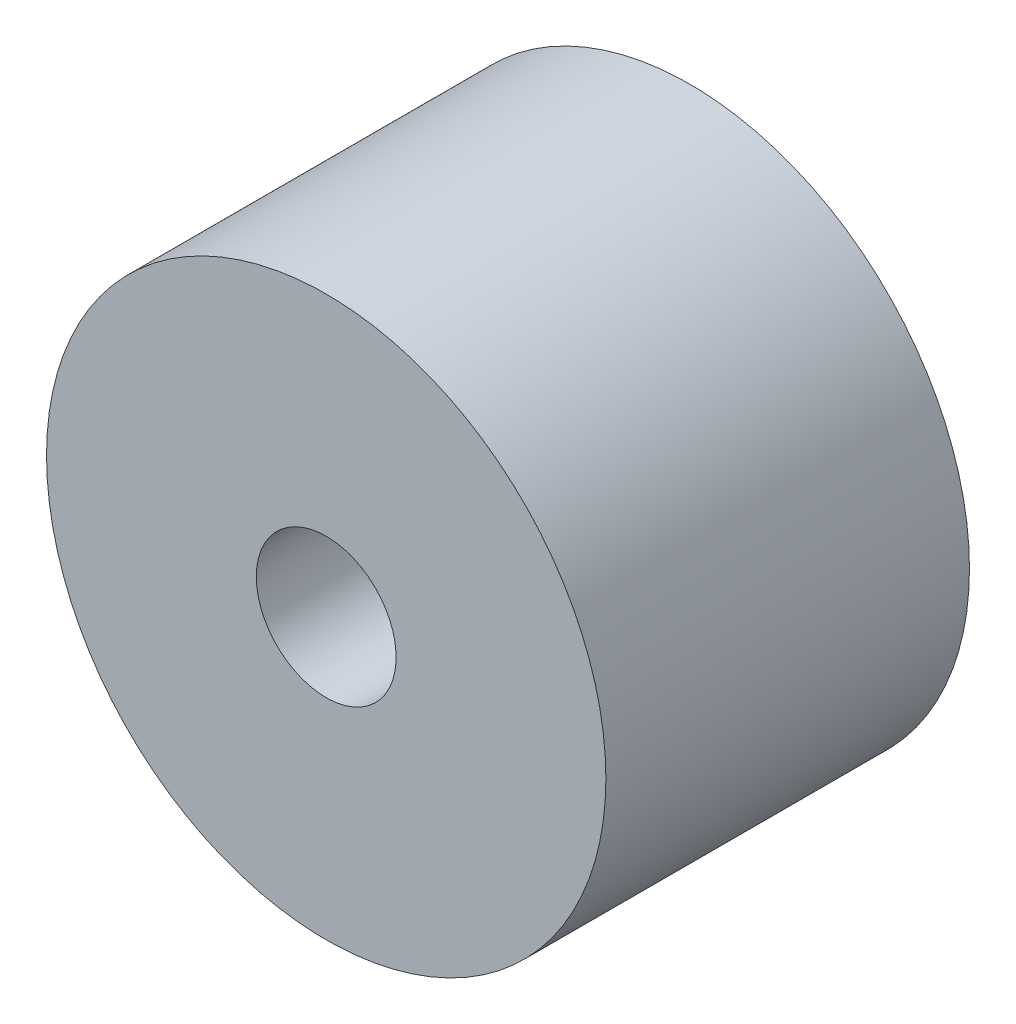
ISO-10303-21;
HEADER;
FILE_DESCRIPTION(('STEP AP214'),'2;1');
FILE_NAME('part.step','',(''),(''),'','','');
FILE_SCHEMA(('AUTOMOTIVE_DESIGN { 1 0 10303 214 1 1 1 1 }'));
ENDSEC;
DATA;
#1=APPLICATION_CONTEXT('core data for automotive mechanical design processes');
#2=APPLICATION_PROTOCOL_DEFINITION('international standard','automotive_design',2000,#1);
#3=PRODUCT_CONTEXT('',#1,'mechanical');
#4=PRODUCT('Part','Part','',(#3));
#5=PRODUCT_RELATED_PRODUCT_CATEGORY('part','',(#4));
#6=PRODUCT_DEFINITION_FORMATION('','',#4);
#7=PRODUCT_DEFINITION_CONTEXT('part definition',#1,'design');
#8=PRODUCT_DEFINITION('design','',#6,#7);
#9=PRODUCT_DEFINITION_SHAPE('','',#8);
#10=(LENGTH_UNIT() NAMED_UNIT(*) SI_UNIT(.MILLI.,.METRE.));
#11=(NAMED_UNIT(*) PLANE_ANGLE_UNIT() SI_UNIT($,.RADIAN.));
#12=(NAMED_UNIT(*) SI_UNIT($,.STERADIAN.) SOLID_ANGLE_UNIT());
#13=UNCERTAINTY_MEASURE_WITH_UNIT(LENGTH_MEASURE(1.E-05),#10,'distance_accuracy_value','');
#14=(GEOMETRIC_REPRESENTATION_CONTEXT(3) GLOBAL_UNCERTAINTY_ASSIGNED_CONTEXT((#13)) GLOBAL_UNIT_ASSIGNED_CONTEXT((#10,
#11,#12)) REPRESENTATION_CONTEXT('',''));
#15=CARTESIAN_POINT('',(0.,0.,0.));
#16=DIRECTION('',(0.,0.,1.));
#17=DIRECTION('',(1.,0.,0.));
#18=AXIS2_PLACEMENT_3D('',#15,#16,#17);
#19=CARTESIAN_POINT('',(0.,0.,13.));
#20=DIRECTION('',(0.,0.,-1.));
#21=DIRECTION('',(-1.,0.,0.));
#22=AXIS2_PLACEMENT_3D('',#19,#20,#21);
#23=CYLINDRICAL_SURFACE('',#22,10.);
#24=CARTESIAN_POINT('',(0.,0.,13.));
#25=DIRECTION('',(0.,0.,1.));
#26=DIRECTION('',(1.,0.,0.));
#27=AXIS2_PLACEMENT_3D('',#24,#25,#26);
#28=CIRCLE('',#27,10.);
#29=CARTESIAN_POINT('',(-10.,0.,13.));
#30=VERTEX_POINT('',#29);
#31=EDGE_CURVE('E47',#30,#30,#28,.T.);
#32=CARTESIAN_POINT('',(0.,0.,0.));
#33=DIRECTION('',(0.,0.,1.));
#34=DIRECTION('',(1.,0.,0.));
#35=AXIS2_PLACEMENT_3D('',#32,#33,#34);
#36=CIRCLE('',#35,10.);
#37=CARTESIAN_POINT('',(-10.,0.,0.));
#38=VERTEX_POINT('',#37);
#39=EDGE_CURVE('E54',#38,#38,#36,.T.);
#40=CARTESIAN_POINT('',(-10.,0.,13.));
#41=CARTESIAN_POINT('',(-10.,0.,12.8645833333333));
#42=CARTESIAN_POINT('',(-10.,0.,12.7291666666667));
#43=CARTESIAN_POINT('',(-10.,0.,12.4583333333333));
#44=CARTESIAN_POINT('',(-10.,0.,12.3229166666667));
#45=CARTESIAN_POINT('',(-10.,0.,12.0520833333333));
#46=CARTESIAN_POINT('',(-10.,0.,11.9166666666667));
#47=CARTESIAN_POINT('',(-10.,0.,11.6458333333333));
#48=CARTESIAN_POINT('',(-10.,0.,11.5104166666667));
#49=CARTESIAN_POINT('',(-10.,0.,11.2395833333333));
#50=CARTESIAN_POINT('',(-10.,0.,11.1041666666667));
#51=CARTESIAN_POINT('',(-10.,0.,10.8333333333333));
#52=CARTESIAN_POINT('',(-10.,0.,10.6979166666667));
#53=CARTESIAN_POINT('',(-10.,0.,10.4270833333333));
#54=CARTESIAN_POINT('',(-10.,0.,10.2916666666667));
#55=CARTESIAN_POINT('',(-10.,0.,10.0208333333333));
#56=CARTESIAN_POINT('',(-10.,0.,9.88541666666667));
#57=CARTESIAN_POINT('',(-10.,0.,9.61458333333333));
#58=CARTESIAN_POINT('',(-10.,0.,9.47916666666667));
#59=CARTESIAN_POINT('',(-10.,0.,9.20833333333333));
#60=CARTESIAN_POINT('',(-10.,0.,9.07291666666666));
#61=CARTESIAN_POINT('',(-10.,0.,8.80208333333333));
#62=CARTESIAN_POINT('',(-10.,0.,8.66666666666667));
#63=CARTESIAN_POINT('',(-10.,0.,8.39583333333333));
#64=CARTESIAN_POINT('',(-10.,0.,8.26041666666667));
#65=CARTESIAN_POINT('',(-10.,0.,7.98958333333333));
#66=CARTESIAN_POINT('',(-10.,0.,7.85416666666667));
#67=CARTESIAN_POINT('',(-10.,0.,7.58333333333333));
#68=CARTESIAN_POINT('',(-10.,0.,7.44791666666667));
#69=CARTESIAN_POINT('',(-10.,0.,7.17708333333333));
#70=CARTESIAN_POINT('',(-10.,0.,7.04166666666667));
#71=CARTESIAN_POINT('',(-10.,0.,6.77083333333333));
#72=CARTESIAN_POINT('',(-10.,0.,6.63541666666667));
#73=CARTESIAN_POINT('',(-10.,0.,6.36458333333333));
#74=CARTESIAN_POINT('',(-10.,0.,6.22916666666667));
#75=CARTESIAN_POINT('',(-10.,0.,5.95833333333333));
#76=CARTESIAN_POINT('',(-10.,0.,5.82291666666667));
#77=CARTESIAN_POINT('',(-10.,0.,5.55208333333333));
#78=CARTESIAN_POINT('',(-10.,0.,5.41666666666667));
#79=CARTESIAN_POINT('',(-10.,0.,5.14583333333333));
#80=CARTESIAN_POINT('',(-10.,0.,5.01041666666667));
#81=CARTESIAN_POINT('',(-10.,0.,4.73958333333333));
#82=CARTESIAN_POINT('',(-10.,0.,4.60416666666667));
#83=CARTESIAN_POINT('',(-10.,0.,4.33333333333333));
#84=CARTESIAN_POINT('',(-10.,0.,4.19791666666667));
#85=CARTESIAN_POINT('',(-10.,0.,3.92708333333333));
#86=CARTESIAN_POINT('',(-10.,0.,3.79166666666667));
#87=CARTESIAN_POINT('',(-10.,0.,3.52083333333333));
#88=CARTESIAN_POINT('',(-10.,0.,3.38541666666667));
#89=CARTESIAN_POINT('',(-10.,0.,3.11458333333333));
#90=CARTESIAN_POINT('',(-10.,0.,2.97916666666667));
#91=CARTESIAN_POINT('',(-10.,0.,2.70833333333333));
#92=CARTESIAN_POINT('',(-10.,0.,2.57291666666667));
#93=CARTESIAN_POINT('',(-10.,0.,2.30208333333333));
#94=CARTESIAN_POINT('',(-10.,0.,2.16666666666667));
#95=CARTESIAN_POINT('',(-10.,0.,1.89583333333333));
#96=CARTESIAN_POINT('',(-10.,0.,1.76041666666667));
#97=CARTESIAN_POINT('',(-10.,0.,1.48958333333333));
#98=CARTESIAN_POINT('',(-10.,0.,1.35416666666667));
#99=CARTESIAN_POINT('',(-10.,0.,1.08333333333333));
#100=CARTESIAN_POINT('',(-10.,0.,0.947916666666667));
#101=CARTESIAN_POINT('',(-10.,0.,0.677083333333334));
#102=CARTESIAN_POINT('',(-10.,0.,0.541666666666667));
#103=CARTESIAN_POINT('',(-10.,0.,0.270833333333334));
#104=CARTESIAN_POINT('',(-10.,0.,0.135416666666667));
#105=CARTESIAN_POINT('',(-10.,0.,0.));
#106=B_SPLINE_CURVE_WITH_KNOTS('',3,(#40,#41,#42,#43,#44,#45,#46,#47,#48,#49,#50,#51,#52,#53,
#54,#55,#56,#57,#58,#59,#60,#61,#62,#63,#64,#65,#66,#67,#68,#69,#70,#71,#72,#73,#74,#75,#76,#77,
#78,#79,#80,#81,#82,#83,#84,#85,#86,#87,#88,#89,#90,#91,#92,#93,#94,#95,#96,#97,#98,#99,#100,
#101,#102,#103,#104,#105),.UNSPECIFIED.,.F.,.F.,(4,2,2,2,2,2,2,2,2,2,2,2,2,2,2,2,2,2,2,2,2,2,2,
2,2,2,2,2,2,2,2,2,4),(0.,0.40625,0.812500000000001,1.21875,1.625,2.03125,2.4375,2.84375,3.25,
3.65625,4.0625,4.46875,4.875,5.28125,5.6875,6.09375,6.5,6.90625,7.3125,7.71875,8.125,8.53125,
8.9375,9.34375,9.75,10.15625,10.5625,10.96875,11.375,11.78125,12.1875,12.59375,13.),.UNSPECIFIED.);
#107=EDGE_CURVE('BSEAM39',#30,#38,#106,.T.);
#108=ORIENTED_EDGE('',*,*,#31,.F.);
#109=ORIENTED_EDGE('',*,*,#39,.T.);
#110=ORIENTED_EDGE('',*,*,#107,.T.);
#111=ORIENTED_EDGE('',*,*,#107,.F.);
#112=EDGE_LOOP('',(#108,#110,#109,#111));
#113=FACE_BOUND('',#112,.T.);
#114=ADVANCED_FACE('F39',(#113),#23,.T.);
#115=CARTESIAN_POINT('',(0.,0.,13.));
#116=DIRECTION('',(0.,0.,-1.));
#117=DIRECTION('',(-1.,0.,0.));
#118=AXIS2_PLACEMENT_3D('',#115,#116,#117);
#119=CYLINDRICAL_SURFACE('',#118,2.5);
#120=CARTESIAN_POINT('',(0.,0.,13.));
#121=DIRECTION('',(0.,0.,1.));
#122=DIRECTION('',(1.,0.,0.));
#123=AXIS2_PLACEMENT_3D('',#120,#121,#122);
#124=CIRCLE('',#123,2.5);
#125=CARTESIAN_POINT('',(-2.5,0.,13.));
#126=VERTEX_POINT('',#125);
#127=EDGE_CURVE('E10',#126,#126,#124,.T.);
#128=CARTESIAN_POINT('',(0.,0.,0.));
#129=DIRECTION('',(0.,0.,1.));
#130=DIRECTION('',(1.,0.,0.));
#131=AXIS2_PLACEMENT_3D('',#128,#129,#130);
#132=CIRCLE('',#131,2.5);
#133=CARTESIAN_POINT('',(-2.5,0.,0.));
#134=VERTEX_POINT('',#133);
#135=EDGE_CURVE('E42',#134,#134,#132,.T.);
#136=CARTESIAN_POINT('',(-2.5,0.,13.));
#137=CARTESIAN_POINT('',(-2.5,0.,12.8645833333333));
#138=CARTESIAN_POINT('',(-2.5,0.,12.7291666666667));
#139=CARTESIAN_POINT('',(-2.5,0.,12.4583333333333));
#140=CARTESIAN_POINT('',(-2.5,0.,12.3229166666667));
#141=CARTESIAN_POINT('',(-2.5,0.,12.0520833333333));
#142=CARTESIAN_POINT('',(-2.5,0.,11.9166666666667));
#143=CARTESIAN_POINT('',(-2.5,0.,11.6458333333333));
#144=CARTESIAN_POINT('',(-2.5,0.,11.5104166666667));
#145=CARTESIAN_POINT('',(-2.5,0.,11.2395833333333));
#146=CARTESIAN_POINT('',(-2.5,0.,11.1041666666667));
#147=CARTESIAN_POINT('',(-2.5,0.,10.8333333333333));
#148=CARTESIAN_POINT('',(-2.5,0.,10.6979166666667));
#149=CARTESIAN_POINT('',(-2.5,0.,10.4270833333333));
#150=CARTESIAN_POINT('',(-2.5,0.,10.2916666666667));
#151=CARTESIAN_POINT('',(-2.5,0.,10.0208333333333));
#152=CARTESIAN_POINT('',(-2.5,0.,9.88541666666667));
#153=CARTESIAN_POINT('',(-2.5,0.,9.61458333333333));
#154=CARTESIAN_POINT('',(-2.5,0.,9.47916666666667));
#155=CARTESIAN_POINT('',(-2.5,0.,9.20833333333333));
#156=CARTESIAN_POINT('',(-2.5,0.,9.07291666666667));
#157=CARTESIAN_POINT('',(-2.5,0.,8.80208333333333));
#158=CARTESIAN_POINT('',(-2.5,0.,8.66666666666667));
#159=CARTESIAN_POINT('',(-2.5,0.,8.39583333333333));
#160=CARTESIAN_POINT('',(-2.5,0.,8.26041666666667));
#161=CARTESIAN_POINT('',(-2.5,0.,7.98958333333333));
#162=CARTESIAN_POINT('',(-2.5,0.,7.85416666666667));
#163=CARTESIAN_POINT('',(-2.5,0.,7.58333333333333));
#164=CARTESIAN_POINT('',(-2.5,0.,7.44791666666667));
#165=CARTESIAN_POINT('',(-2.5,0.,7.17708333333333));
#166=CARTESIAN_POINT('',(-2.5,0.,7.04166666666667));
#167=CARTESIAN_POINT('',(-2.5,0.,6.77083333333333));
#168=CARTESIAN_POINT('',(-2.5,0.,6.63541666666667));
#169=CARTESIAN_POINT('',(-2.5,0.,6.36458333333333));
#170=CARTESIAN_POINT('',(-2.5,0.,6.22916666666667));
#171=CARTESIAN_POINT('',(-2.5,0.,5.95833333333333));
#172=CARTESIAN_POINT('',(-2.5,0.,5.82291666666667));
#173=CARTESIAN_POINT('',(-2.5,0.,5.55208333333333));
#174=CARTESIAN_POINT('',(-2.5,0.,5.41666666666667));
#175=CARTESIAN_POINT('',(-2.5,0.,5.14583333333333));
#176=CARTESIAN_POINT('',(-2.5,0.,5.01041666666667));
#177=CARTESIAN_POINT('',(-2.5,0.,4.73958333333333));
#178=CARTESIAN_POINT('',(-2.5,0.,4.60416666666667));
#179=CARTESIAN_POINT('',(-2.5,0.,4.33333333333333));
#180=CARTESIAN_POINT('',(-2.5,0.,4.19791666666667));
#181=CARTESIAN_POINT('',(-2.5,0.,3.92708333333333));
#182=CARTESIAN_POINT('',(-2.5,0.,3.79166666666667));
#183=CARTESIAN_POINT('',(-2.5,0.,3.52083333333333));
#184=CARTESIAN_POINT('',(-2.5,0.,3.38541666666667));
#185=CARTESIAN_POINT('',(-2.5,0.,3.11458333333333));
#186=CARTESIAN_POINT('',(-2.5,0.,2.97916666666667));
#187=CARTESIAN_POINT('',(-2.5,0.,2.70833333333333));
#188=CARTESIAN_POINT('',(-2.5,0.,2.57291666666667));
#189=CARTESIAN_POINT('',(-2.5,0.,2.30208333333333));
#190=CARTESIAN_POINT('',(-2.5,0.,2.16666666666667));
#191=CARTESIAN_POINT('',(-2.5,0.,1.89583333333333));
#192=CARTESIAN_POINT('',(-2.5,0.,1.76041666666667));
#193=CARTESIAN_POINT('',(-2.5,0.,1.48958333333333));
#194=CARTESIAN_POINT('',(-2.5,0.,1.35416666666667));
#195=CARTESIAN_POINT('',(-2.5,0.,1.08333333333333));
#196=CARTESIAN_POINT('',(-2.5,0.,0.947916666666667));
#197=CARTESIAN_POINT('',(-2.5,0.,0.677083333333334));
#198=CARTESIAN_POINT('',(-2.5,0.,0.541666666666667));
#199=CARTESIAN_POINT('',(-2.5,0.,0.270833333333334));
#200=CARTESIAN_POINT('',(-2.5,0.,0.135416666666667));
#201=CARTESIAN_POINT('',(-2.5,0.,0.));
#202=B_SPLINE_CURVE_WITH_KNOTS('',3,(#136,#137,#138,#139,#140,#141,#142,#143,#144,#145,#146,
#147,#148,#149,#150,#151,#152,#153,#154,#155,#156,#157,#158,#159,#160,#161,#162,#163,#164,#165,
#166,#167,#168,#169,#170,#171,#172,#173,#174,#175,#176,#177,#178,#179,#180,#181,#182,#183,#184,
#185,#186,#187,#188,#189,#190,#191,#192,#193,#194,#195,#196,#197,#198,#199,#200,#201),
.UNSPECIFIED.,.F.,.F.,(4,2,2,2,2,2,2,2,2,2,2,2,2,2,2,2,2,2,2,2,2,2,2,2,2,2,2,2,2,2,2,2,4),(0.,
0.406249999999999,0.812499999999999,1.21875,1.625,2.03125,2.4375,2.84375,3.25,3.65625,4.0625,
4.46875,4.875,5.28125,5.6875,6.09375,6.5,6.90625,7.3125,7.71875,8.125,8.53125,8.9375,9.34375,
9.75,10.15625,10.5625,10.96875,11.375,11.78125,12.1875,12.59375,13.),.UNSPECIFIED.);
#203=EDGE_CURVE('BSEAM65',#126,#134,#202,.T.);
#204=ORIENTED_EDGE('',*,*,#127,.T.);
#205=ORIENTED_EDGE('',*,*,#135,.F.);
#206=ORIENTED_EDGE('',*,*,#203,.T.);
#207=ORIENTED_EDGE('',*,*,#203,.F.);
#208=EDGE_LOOP('',(#204,#206,#205,#207));
#209=FACE_BOUND('',#208,.T.);
#210=ADVANCED_FACE('F65',(#209),#119,.F.);
#211=CARTESIAN_POINT('',(0.,0.,13.));
#212=DIRECTION('',(0.,0.,1.));
#213=DIRECTION('',(1.,0.,0.));
#214=AXIS2_PLACEMENT_3D('',#211,#212,#213);
#215=PLANE('',#214);
#216=ORIENTED_EDGE('',*,*,#31,.T.);
#217=EDGE_LOOP('',(#216));
#218=FACE_BOUND('',#217,.T.);
#219=ORIENTED_EDGE('',*,*,#127,.F.);
#220=EDGE_LOOP('',(#219));
#221=FACE_BOUND('',#220,.T.);
#222=ADVANCED_FACE('F67',(#218,#221),#215,.T.);
#223=CARTESIAN_POINT('',(0.,0.,0.));
#224=DIRECTION('',(0.,0.,1.));
#225=DIRECTION('',(1.,0.,0.));
#226=AXIS2_PLACEMENT_3D('',#223,#224,#225);
#227=PLANE('',#226);
#228=ORIENTED_EDGE('',*,*,#39,.F.);
#229=EDGE_LOOP('',(#228));
#230=FACE_BOUND('',#229,.T.);
#231=ORIENTED_EDGE('',*,*,#135,.T.);
#232=EDGE_LOOP('',(#231));
#233=FACE_BOUND('',#232,.T.);
#234=ADVANCED_FACE('F63',(#230,#233),#227,.F.);
#235=CLOSED_SHELL('',(#114,#210,#222,#234));
#236=MANIFOLD_SOLID_BREP('B2',#235);
#237=ADVANCED_BREP_SHAPE_REPRESENTATION('',(#18,#236),#14);
#238=SHAPE_DEFINITION_REPRESENTATION(#9,#237);
ENDSEC;
END-ISO-10303-21;
